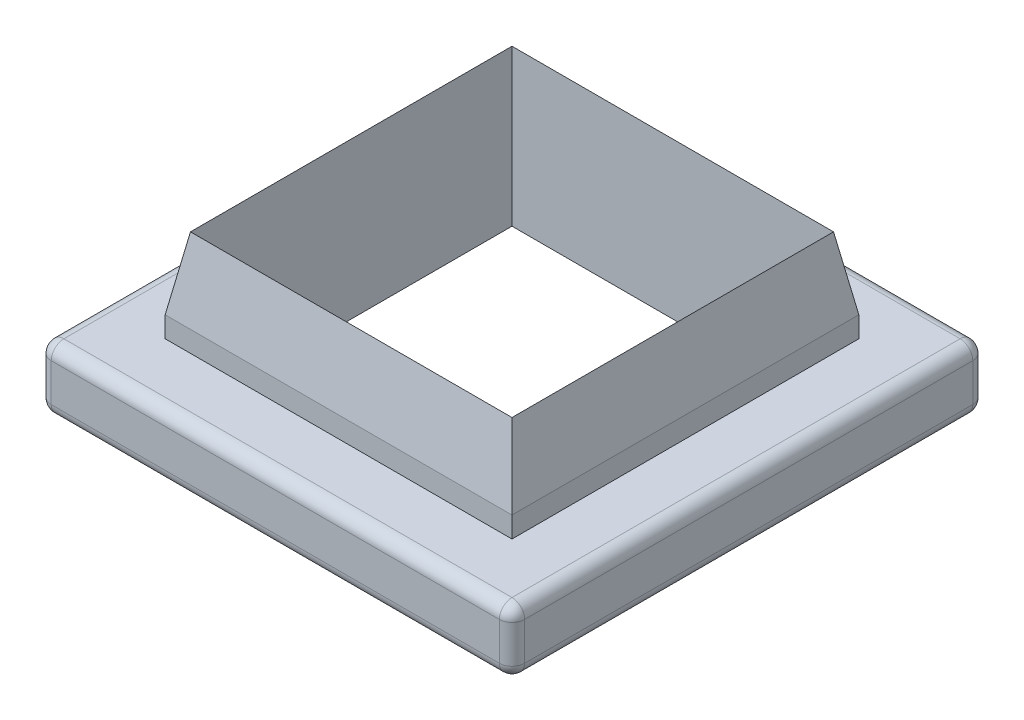
ISO-10303-21;
HEADER;
FILE_DESCRIPTION(('STEP AP214'),'2;1');
FILE_NAME('part.step','',(''),(''),'','','');
FILE_SCHEMA(('AUTOMOTIVE_DESIGN { 1 0 10303 214 1 1 1 1 }'));
ENDSEC;
DATA;
#1=APPLICATION_CONTEXT('core data for automotive mechanical design processes');
#2=APPLICATION_PROTOCOL_DEFINITION('international standard','automotive_design',2000,#1);
#3=PRODUCT_CONTEXT('',#1,'mechanical');
#4=PRODUCT('Part','Part','',(#3));
#5=PRODUCT_RELATED_PRODUCT_CATEGORY('part','',(#4));
#6=PRODUCT_DEFINITION_FORMATION('','',#4);
#7=PRODUCT_DEFINITION_CONTEXT('part definition',#1,'design');
#8=PRODUCT_DEFINITION('design','',#6,#7);
#9=PRODUCT_DEFINITION_SHAPE('','',#8);
#10=(LENGTH_UNIT() NAMED_UNIT(*) SI_UNIT(.MILLI.,.METRE.));
#11=(NAMED_UNIT(*) PLANE_ANGLE_UNIT() SI_UNIT($,.RADIAN.));
#12=(NAMED_UNIT(*) SI_UNIT($,.STERADIAN.) SOLID_ANGLE_UNIT());
#13=UNCERTAINTY_MEASURE_WITH_UNIT(LENGTH_MEASURE(1.E-05),#10,'distance_accuracy_value','');
#14=(GEOMETRIC_REPRESENTATION_CONTEXT(3) GLOBAL_UNCERTAINTY_ASSIGNED_CONTEXT((#13)) GLOBAL_UNIT_ASSIGNED_CONTEXT((#10,
#11,#12)) REPRESENTATION_CONTEXT('',''));
#15=CARTESIAN_POINT('',(0.,0.,0.));
#16=DIRECTION('',(0.,0.,1.));
#17=DIRECTION('',(1.,0.,0.));
#18=AXIS2_PLACEMENT_3D('',#15,#16,#17);
#19=CARTESIAN_POINT('',(0.,35.,0.));
#20=DIRECTION('',(0.,0.,-1.));
#21=DIRECTION('',(-1.,0.,0.));
#22=AXIS2_PLACEMENT_3D('',#19,#20,#21);
#23=PLANE('',#22);
#24=DIRECTION('',(0.,-1.,0.));
#25=VECTOR('',#24,1.);
#26=CARTESIAN_POINT('',(27.4,35.,0.));
#27=LINE('',#26,#25);
#28=CARTESIAN_POINT('',(27.4,6.64359090190982,0.));
#29=VERTEX_POINT('',#28);
#30=CARTESIAN_POINT('',(27.4,5.,0.));
#31=VERTEX_POINT('',#30);
#32=EDGE_CURVE('E237',#29,#31,#27,.T.);
#33=ORIENTED_EDGE('',*,*,#32,.F.);
#34=DIRECTION('',(-1.,0.,0.));
#35=VECTOR('',#34,1.);
#36=CARTESIAN_POINT('',(0.,6.64359090190982,0.));
#37=LINE('',#36,#35);
#38=CARTESIAN_POINT('',(0.,6.64359090190982,0.));
#39=VERTEX_POINT('',#38);
#40=EDGE_CURVE('E266',#29,#39,#37,.T.);
#41=ORIENTED_EDGE('',*,*,#40,.T.);
#42=DIRECTION('',(0.,-1.,0.));
#43=VECTOR('',#42,1.);
#44=CARTESIAN_POINT('',(0.,35.,0.));
#45=LINE('',#44,#43);
#46=CARTESIAN_POINT('',(0.,5.,0.));
#47=VERTEX_POINT('',#46);
#48=EDGE_CURVE('E194',#39,#47,#45,.T.);
#49=ORIENTED_EDGE('',*,*,#48,.T.);
#50=DIRECTION('',(1.,0.,0.));
#51=VECTOR('',#50,1.);
#52=CARTESIAN_POINT('',(0.,5.,0.));
#53=LINE('',#52,#51);
#54=EDGE_CURVE('E208',#47,#31,#53,.T.);
#55=ORIENTED_EDGE('',*,*,#54,.T.);
#56=EDGE_LOOP('',(#33,#41,#49,#55));
#57=FACE_BOUND('',#56,.T.);
#58=ADVANCED_FACE('F43',(#57),#23,.F.);
#59=CARTESIAN_POINT('',(27.4,35.,0.));
#60=DIRECTION('',(-1.,0.,0.));
#61=DIRECTION('',(0.,0.,1.));
#62=AXIS2_PLACEMENT_3D('',#59,#60,#61);
#63=PLANE('',#62);
#64=DIRECTION('',(0.,-1.,0.));
#65=VECTOR('',#64,1.);
#66=CARTESIAN_POINT('',(27.4,35.,-27.4));
#67=LINE('',#66,#65);
#68=CARTESIAN_POINT('',(27.4,6.64359090190982,-27.4));
#69=VERTEX_POINT('',#68);
#70=CARTESIAN_POINT('',(27.4,5.,-27.4));
#71=VERTEX_POINT('',#70);
#72=EDGE_CURVE('E193',#69,#71,#67,.T.);
#73=ORIENTED_EDGE('',*,*,#72,.F.);
#74=DIRECTION('',(0.,0.,1.));
#75=VECTOR('',#74,1.);
#76=CARTESIAN_POINT('',(27.4,6.64359090190982,0.));
#77=LINE('',#76,#75);
#78=EDGE_CURVE('E260',#69,#29,#77,.T.);
#79=ORIENTED_EDGE('',*,*,#78,.T.);
#80=ORIENTED_EDGE('',*,*,#32,.T.);
#81=DIRECTION('',(0.,0.,-1.));
#82=VECTOR('',#81,1.);
#83=CARTESIAN_POINT('',(27.4,5.,0.));
#84=LINE('',#83,#82);
#85=EDGE_CURVE('E212',#31,#71,#84,.T.);
#86=ORIENTED_EDGE('',*,*,#85,.T.);
#87=EDGE_LOOP('',(#73,#79,#80,#86));
#88=FACE_BOUND('',#87,.T.);
#89=ADVANCED_FACE('F526',(#88),#63,.F.);
#90=CARTESIAN_POINT('',(0.,35.,-27.4));
#91=DIRECTION('',(0.,0.,-1.));
#92=DIRECTION('',(-1.,0.,0.));
#93=AXIS2_PLACEMENT_3D('',#90,#91,#92);
#94=PLANE('',#93);
#95=DIRECTION('',(0.,-1.,0.));
#96=VECTOR('',#95,1.);
#97=CARTESIAN_POINT('',(0.,35.,-27.4));
#98=LINE('',#97,#96);
#99=CARTESIAN_POINT('',(0.,6.64359090190982,-27.4));
#100=VERTEX_POINT('',#99);
#101=CARTESIAN_POINT('',(0.,5.,-27.4));
#102=VERTEX_POINT('',#101);
#103=EDGE_CURVE('E180',#100,#102,#98,.T.);
#104=ORIENTED_EDGE('',*,*,#103,.F.);
#105=DIRECTION('',(1.,0.,0.));
#106=VECTOR('',#105,1.);
#107=CARTESIAN_POINT('',(0.,6.64359090190982,-27.4));
#108=LINE('',#107,#106);
#109=EDGE_CURVE('E240',#100,#69,#108,.T.);
#110=ORIENTED_EDGE('',*,*,#109,.T.);
#111=ORIENTED_EDGE('',*,*,#72,.T.);
#112=DIRECTION('',(1.,0.,0.));
#113=VECTOR('',#112,1.);
#114=CARTESIAN_POINT('',(0.,5.,-27.4));
#115=LINE('',#114,#113);
#116=EDGE_CURVE('E197',#102,#71,#115,.T.);
#117=ORIENTED_EDGE('',*,*,#116,.F.);
#118=EDGE_LOOP('',(#104,#110,#111,#117));
#119=FACE_BOUND('',#118,.T.);
#120=ADVANCED_FACE('F198',(#119),#94,.T.);
#121=CARTESIAN_POINT('',(0.,35.,-1.));
#122=DIRECTION('',(0.,0.,-1.));
#123=DIRECTION('',(-1.,0.,0.));
#124=AXIS2_PLACEMENT_3D('',#121,#122,#123);
#125=PLANE('',#124);
#126=DIRECTION('',(0.,-1.,0.));
#127=VECTOR('',#126,1.);
#128=CARTESIAN_POINT('',(1.,35.,-1.));
#129=LINE('',#128,#127);
#130=CARTESIAN_POINT('',(1.,12.3148727215276,-1.));
#131=VERTEX_POINT('',#130);
#132=CARTESIAN_POINT('',(1.,0.,-1.));
#133=VERTEX_POINT('',#132);
#134=EDGE_CURVE('E233',#131,#133,#129,.T.);
#135=ORIENTED_EDGE('',*,*,#134,.F.);
#136=DIRECTION('',(1.,0.,0.));
#137=VECTOR('',#136,1.);
#138=CARTESIAN_POINT('',(0.,12.3148727215276,-1.));
#139=LINE('',#138,#137);
#140=CARTESIAN_POINT('',(26.4,12.3148727215276,-1.));
#141=VERTEX_POINT('',#140);
#142=EDGE_CURVE('E263',#131,#141,#139,.T.);
#143=ORIENTED_EDGE('',*,*,#142,.T.);
#144=DIRECTION('',(0.,-1.,0.));
#145=VECTOR('',#144,1.);
#146=CARTESIAN_POINT('',(26.4,35.,-1.));
#147=LINE('',#146,#145);
#148=CARTESIAN_POINT('',(26.4,0.,-1.));
#149=VERTEX_POINT('',#148);
#150=EDGE_CURVE('E231',#141,#149,#147,.T.);
#151=ORIENTED_EDGE('',*,*,#150,.T.);
#152=DIRECTION('',(1.,0.,0.));
#153=VECTOR('',#152,1.);
#154=CARTESIAN_POINT('',(0.,0.,-1.));
#155=LINE('',#154,#153);
#156=EDGE_CURVE('E204',#133,#149,#155,.T.);
#157=ORIENTED_EDGE('',*,*,#156,.F.);
#158=EDGE_LOOP('',(#135,#143,#151,#157));
#159=FACE_BOUND('',#158,.T.);
#160=ADVANCED_FACE('F548',(#159),#125,.T.);
#161=CARTESIAN_POINT('',(1.,35.,0.));
#162=DIRECTION('',(-1.,0.,0.));
#163=DIRECTION('',(0.,0.,1.));
#164=AXIS2_PLACEMENT_3D('',#161,#162,#163);
#165=PLANE('',#164);
#166=DIRECTION('',(0.,-1.,0.));
#167=VECTOR('',#166,1.);
#168=CARTESIAN_POINT('',(1.,35.,-26.4));
#169=LINE('',#168,#167);
#170=CARTESIAN_POINT('',(1.,12.3148727215276,-26.4));
#171=VERTEX_POINT('',#170);
#172=CARTESIAN_POINT('',(1.,0.,-26.4));
#173=VERTEX_POINT('',#172);
#174=EDGE_CURVE('E246',#171,#173,#169,.T.);
#175=ORIENTED_EDGE('',*,*,#174,.F.);
#176=DIRECTION('',(0.,0.,-1.));
#177=VECTOR('',#176,1.);
#178=CARTESIAN_POINT('',(1.,12.3148727215276,0.));
#179=LINE('',#178,#177);
#180=EDGE_CURVE('E271',#171,#131,#179,.F.);
#181=ORIENTED_EDGE('',*,*,#180,.T.);
#182=ORIENTED_EDGE('',*,*,#134,.T.);
#183=DIRECTION('',(0.,0.,-1.));
#184=VECTOR('',#183,1.);
#185=CARTESIAN_POINT('',(1.,0.,0.));
#186=LINE('',#185,#184);
#187=EDGE_CURVE('E219',#133,#173,#186,.T.);
#188=ORIENTED_EDGE('',*,*,#187,.T.);
#189=EDGE_LOOP('',(#175,#181,#182,#188));
#190=FACE_BOUND('',#189,.T.);
#191=ADVANCED_FACE('F544',(#190),#165,.F.);
#192=CARTESIAN_POINT('',(0.,35.,-26.4));
#193=DIRECTION('',(0.,0.,-1.));
#194=DIRECTION('',(-1.,0.,0.));
#195=AXIS2_PLACEMENT_3D('',#192,#193,#194);
#196=PLANE('',#195);
#197=DIRECTION('',(0.,-1.,0.));
#198=VECTOR('',#197,1.);
#199=CARTESIAN_POINT('',(26.4,35.,-26.4));
#200=LINE('',#199,#198);
#201=CARTESIAN_POINT('',(26.4,12.3148727215276,-26.4));
#202=VERTEX_POINT('',#201);
#203=CARTESIAN_POINT('',(26.4,0.,-26.4));
#204=VERTEX_POINT('',#203);
#205=EDGE_CURVE('E243',#202,#204,#200,.T.);
#206=ORIENTED_EDGE('',*,*,#205,.F.);
#207=DIRECTION('',(1.,0.,0.));
#208=VECTOR('',#207,1.);
#209=CARTESIAN_POINT('',(0.,12.3148727215276,-26.4));
#210=LINE('',#209,#208);
#211=EDGE_CURVE('E253',#202,#171,#210,.F.);
#212=ORIENTED_EDGE('',*,*,#211,.T.);
#213=ORIENTED_EDGE('',*,*,#174,.T.);
#214=DIRECTION('',(1.,0.,0.));
#215=VECTOR('',#214,1.);
#216=CARTESIAN_POINT('',(0.,0.,-26.4));
#217=LINE('',#216,#215);
#218=EDGE_CURVE('E223',#173,#204,#217,.T.);
#219=ORIENTED_EDGE('',*,*,#218,.T.);
#220=EDGE_LOOP('',(#206,#212,#213,#219));
#221=FACE_BOUND('',#220,.T.);
#222=ADVANCED_FACE('F540',(#221),#196,.F.);
#223=CARTESIAN_POINT('',(26.4,35.,0.));
#224=DIRECTION('',(-1.,0.,0.));
#225=DIRECTION('',(0.,0.,1.));
#226=AXIS2_PLACEMENT_3D('',#223,#224,#225);
#227=PLANE('',#226);
#228=ORIENTED_EDGE('',*,*,#150,.F.);
#229=DIRECTION('',(0.,0.,-1.));
#230=VECTOR('',#229,1.);
#231=CARTESIAN_POINT('',(26.4,12.3148727215276,0.));
#232=LINE('',#231,#230);
#233=EDGE_CURVE('E257',#141,#202,#232,.T.);
#234=ORIENTED_EDGE('',*,*,#233,.T.);
#235=ORIENTED_EDGE('',*,*,#205,.T.);
#236=DIRECTION('',(0.,0.,-1.));
#237=VECTOR('',#236,1.);
#238=CARTESIAN_POINT('',(26.4,0.,0.));
#239=LINE('',#238,#237);
#240=EDGE_CURVE('E227',#149,#204,#239,.T.);
#241=ORIENTED_EDGE('',*,*,#240,.F.);
#242=EDGE_LOOP('',(#228,#234,#235,#241));
#243=FACE_BOUND('',#242,.T.);
#244=ADVANCED_FACE('F537',(#243),#227,.T.);
#245=CARTESIAN_POINT('',(0.,35.,0.));
#246=DIRECTION('',(-1.,0.,0.));
#247=DIRECTION('',(0.,0.,1.));
#248=AXIS2_PLACEMENT_3D('',#245,#246,#247);
#249=PLANE('',#248);
#250=ORIENTED_EDGE('',*,*,#48,.F.);
#251=DIRECTION('',(0.,0.,-1.));
#252=VECTOR('',#251,1.);
#253=CARTESIAN_POINT('',(0.,6.64359090190982,0.));
#254=LINE('',#253,#252);
#255=EDGE_CURVE('E188',#39,#100,#254,.T.);
#256=ORIENTED_EDGE('',*,*,#255,.T.);
#257=ORIENTED_EDGE('',*,*,#103,.T.);
#258=DIRECTION('',(0.,0.,-1.));
#259=VECTOR('',#258,1.);
#260=CARTESIAN_POINT('',(0.,5.,0.));
#261=LINE('',#260,#259);
#262=EDGE_CURVE('E185',#47,#102,#261,.T.);
#263=ORIENTED_EDGE('',*,*,#262,.F.);
#264=EDGE_LOOP('',(#250,#256,#257,#263));
#265=FACE_BOUND('',#264,.T.);
#266=ADVANCED_FACE('F183',(#265),#249,.T.);
#267=CARTESIAN_POINT('',(0.,0.,0.));
#268=DIRECTION('',(0.,1.,0.));
#269=DIRECTION('',(0.,0.,1.));
#270=AXIS2_PLACEMENT_3D('',#267,#268,#269);
#271=PLANE('',#270);
#272=DIRECTION('',(1.,0.,0.));
#273=VECTOR('',#272,1.);
#274=CARTESIAN_POINT('',(32.4,0.,-31.4));
#275=LINE('',#274,#273);
#276=CARTESIAN_POINT('',(-4.,0.,-31.4));
#277=VERTEX_POINT('',#276);
#278=CARTESIAN_POINT('',(31.4,0.,-31.4));
#279=VERTEX_POINT('',#278);
#280=EDGE_CURVE('E343',#277,#279,#275,.T.);
#281=ORIENTED_EDGE('',*,*,#280,.T.);
#282=DIRECTION('',(0.,0.,-1.));
#283=VECTOR('',#282,1.);
#284=CARTESIAN_POINT('',(31.4,0.,0.));
#285=LINE('',#284,#283);
#286=CARTESIAN_POINT('',(31.4,0.,4.));
#287=VERTEX_POINT('',#286);
#288=EDGE_CURVE('E350',#279,#287,#285,.F.);
#289=ORIENTED_EDGE('',*,*,#288,.T.);
#290=DIRECTION('',(1.,0.,0.));
#291=VECTOR('',#290,1.);
#292=CARTESIAN_POINT('',(0.,0.,4.));
#293=LINE('',#292,#291);
#294=CARTESIAN_POINT('',(-4.,0.,4.));
#295=VERTEX_POINT('',#294);
#296=EDGE_CURVE('E346',#287,#295,#293,.F.);
#297=ORIENTED_EDGE('',*,*,#296,.T.);
#298=DIRECTION('',(0.,0.,-1.));
#299=VECTOR('',#298,1.);
#300=CARTESIAN_POINT('',(-4.,0.,-32.4));
#301=LINE('',#300,#299);
#302=EDGE_CURVE('E340',#295,#277,#301,.T.);
#303=ORIENTED_EDGE('',*,*,#302,.T.);
#304=EDGE_LOOP('',(#281,#289,#297,#303));
#305=FACE_BOUND('',#304,.T.);
#306=ORIENTED_EDGE('',*,*,#156,.T.);
#307=ORIENTED_EDGE('',*,*,#240,.T.);
#308=ORIENTED_EDGE('',*,*,#218,.F.);
#309=ORIENTED_EDGE('',*,*,#187,.F.);
#310=EDGE_LOOP('',(#306,#307,#308,#309));
#311=FACE_BOUND('',#310,.T.);
#312=ADVANCED_FACE('F626',(#305,#311),#271,.F.);
#313=CARTESIAN_POINT('',(-5.,5.,0.));
#314=DIRECTION('',(-1.,0.,0.));
#315=DIRECTION('',(0.,0.,1.));
#316=AXIS2_PLACEMENT_3D('',#313,#314,#315);
#317=PLANE('',#316);
#318=DIRECTION('',(0.,-1.,0.));
#319=VECTOR('',#318,1.);
#320=CARTESIAN_POINT('',(-5.,5.,4.));
#321=LINE('',#320,#319);
#322=CARTESIAN_POINT('',(-5.,1.,4.));
#323=VERTEX_POINT('',#322);
#324=CARTESIAN_POINT('',(-5.,4.,4.));
#325=VERTEX_POINT('',#324);
#326=EDGE_CURVE('E307',#323,#325,#321,.F.);
#327=ORIENTED_EDGE('',*,*,#326,.T.);
#328=DIRECTION('',(0.,0.,-1.));
#329=VECTOR('',#328,1.);
#330=CARTESIAN_POINT('',(-5.,4.,0.));
#331=LINE('',#330,#329);
#332=CARTESIAN_POINT('',(-5.,4.,-31.4));
#333=VERTEX_POINT('',#332);
#334=EDGE_CURVE('E311',#325,#333,#331,.T.);
#335=ORIENTED_EDGE('',*,*,#334,.T.);
#336=DIRECTION('',(0.,-1.,0.));
#337=VECTOR('',#336,1.);
#338=CARTESIAN_POINT('',(-5.,5.,-31.4));
#339=LINE('',#338,#337);
#340=CARTESIAN_POINT('',(-5.,1.,-31.4));
#341=VERTEX_POINT('',#340);
#342=EDGE_CURVE('E304',#333,#341,#339,.T.);
#343=ORIENTED_EDGE('',*,*,#342,.T.);
#344=DIRECTION('',(0.,0.,-1.));
#345=VECTOR('',#344,1.);
#346=CARTESIAN_POINT('',(-5.,1.,5.));
#347=LINE('',#346,#345);
#348=EDGE_CURVE('E301',#341,#323,#347,.F.);
#349=ORIENTED_EDGE('',*,*,#348,.T.);
#350=EDGE_LOOP('',(#327,#335,#343,#349));
#351=FACE_BOUND('',#350,.T.);
#352=ADVANCED_FACE('F612',(#351),#317,.T.);
#353=CARTESIAN_POINT('',(0.,5.,5.));
#354=DIRECTION('',(0.,0.,-1.));
#355=DIRECTION('',(-1.,0.,0.));
#356=AXIS2_PLACEMENT_3D('',#353,#354,#355);
#357=PLANE('',#356);
#358=DIRECTION('',(1.,0.,0.));
#359=VECTOR('',#358,1.);
#360=CARTESIAN_POINT('',(-5.,4.,5.));
#361=LINE('',#360,#359);
#362=CARTESIAN_POINT('',(31.4,4.,5.));
#363=VERTEX_POINT('',#362);
#364=CARTESIAN_POINT('',(-4.,4.,5.));
#365=VERTEX_POINT('',#364);
#366=EDGE_CURVE('E294',#363,#365,#361,.F.);
#367=ORIENTED_EDGE('',*,*,#366,.T.);
#368=DIRECTION('',(0.,-1.,0.));
#369=VECTOR('',#368,1.);
#370=CARTESIAN_POINT('',(-4.,0.,5.));
#371=LINE('',#370,#369);
#372=CARTESIAN_POINT('',(-4.,1.,5.));
#373=VERTEX_POINT('',#372);
#374=EDGE_CURVE('E297',#365,#373,#371,.T.);
#375=ORIENTED_EDGE('',*,*,#374,.T.);
#376=DIRECTION('',(1.,0.,0.));
#377=VECTOR('',#376,1.);
#378=CARTESIAN_POINT('',(0.,1.,5.));
#379=LINE('',#378,#377);
#380=CARTESIAN_POINT('',(31.4,1.,5.));
#381=VERTEX_POINT('',#380);
#382=EDGE_CURVE('E274',#373,#381,#379,.T.);
#383=ORIENTED_EDGE('',*,*,#382,.T.);
#384=DIRECTION('',(0.,-1.,0.));
#385=VECTOR('',#384,1.);
#386=CARTESIAN_POINT('',(31.4,5.,5.));
#387=LINE('',#386,#385);
#388=EDGE_CURVE('E291',#381,#363,#387,.F.);
#389=ORIENTED_EDGE('',*,*,#388,.T.);
#390=EDGE_LOOP('',(#367,#375,#383,#389));
#391=FACE_BOUND('',#390,.T.);
#392=ADVANCED_FACE('F618',(#391),#357,.F.);
#393=CARTESIAN_POINT('',(32.4,5.,0.));
#394=DIRECTION('',(-1.,0.,0.));
#395=DIRECTION('',(0.,0.,1.));
#396=AXIS2_PLACEMENT_3D('',#393,#394,#395);
#397=PLANE('',#396);
#398=DIRECTION('',(0.,-1.,0.));
#399=VECTOR('',#398,1.);
#400=CARTESIAN_POINT('',(32.4,5.,4.));
#401=LINE('',#400,#399);
#402=CARTESIAN_POINT('',(32.4,4.,4.));
#403=VERTEX_POINT('',#402);
#404=CARTESIAN_POINT('',(32.4,1.,4.));
#405=VERTEX_POINT('',#404);
#406=EDGE_CURVE('E333',#403,#405,#401,.T.);
#407=ORIENTED_EDGE('',*,*,#406,.T.);
#408=DIRECTION('',(0.,0.,-1.));
#409=VECTOR('',#408,1.);
#410=CARTESIAN_POINT('',(32.4,1.,0.));
#411=LINE('',#410,#409);
#412=CARTESIAN_POINT('',(32.4,1.,-31.4));
#413=VERTEX_POINT('',#412);
#414=EDGE_CURVE('E337',#405,#413,#411,.T.);
#415=ORIENTED_EDGE('',*,*,#414,.T.);
#416=DIRECTION('',(0.,-1.,0.));
#417=VECTOR('',#416,1.);
#418=CARTESIAN_POINT('',(32.4,5.,-31.4));
#419=LINE('',#418,#417);
#420=CARTESIAN_POINT('',(32.4,4.,-31.4));
#421=VERTEX_POINT('',#420);
#422=EDGE_CURVE('E330',#413,#421,#419,.F.);
#423=ORIENTED_EDGE('',*,*,#422,.T.);
#424=DIRECTION('',(0.,0.,-1.));
#425=VECTOR('',#424,1.);
#426=CARTESIAN_POINT('',(32.4,4.,5.));
#427=LINE('',#426,#425);
#428=EDGE_CURVE('E327',#421,#403,#427,.F.);
#429=ORIENTED_EDGE('',*,*,#428,.T.);
#430=EDGE_LOOP('',(#407,#415,#423,#429));
#431=FACE_BOUND('',#430,.T.);
#432=ADVANCED_FACE('F472',(#431),#397,.F.);
#433=CARTESIAN_POINT('',(0.,5.,-32.4));
#434=DIRECTION('',(0.,0.,-1.));
#435=DIRECTION('',(-1.,0.,0.));
#436=AXIS2_PLACEMENT_3D('',#433,#434,#435);
#437=PLANE('',#436);
#438=DIRECTION('',(1.,0.,0.));
#439=VECTOR('',#438,1.);
#440=CARTESIAN_POINT('',(0.,4.,-32.4));
#441=LINE('',#440,#439);
#442=CARTESIAN_POINT('',(-4.,4.,-32.4));
#443=VERTEX_POINT('',#442);
#444=CARTESIAN_POINT('',(31.4,4.,-32.4));
#445=VERTEX_POINT('',#444);
#446=EDGE_CURVE('E64',#443,#445,#441,.T.);
#447=ORIENTED_EDGE('',*,*,#446,.T.);
#448=DIRECTION('',(0.,-1.,0.));
#449=VECTOR('',#448,1.);
#450=CARTESIAN_POINT('',(31.4,0.,-32.4));
#451=LINE('',#450,#449);
#452=CARTESIAN_POINT('',(31.4,1.,-32.4));
#453=VERTEX_POINT('',#452);
#454=EDGE_CURVE('E11',#445,#453,#451,.T.);
#455=ORIENTED_EDGE('',*,*,#454,.T.);
#456=DIRECTION('',(1.,0.,0.));
#457=VECTOR('',#456,1.);
#458=CARTESIAN_POINT('',(-5.,1.,-32.4));
#459=LINE('',#458,#457);
#460=CARTESIAN_POINT('',(-4.,1.,-32.4));
#461=VERTEX_POINT('',#460);
#462=EDGE_CURVE('E53',#453,#461,#459,.F.);
#463=ORIENTED_EDGE('',*,*,#462,.T.);
#464=DIRECTION('',(0.,-1.,0.));
#465=VECTOR('',#464,1.);
#466=CARTESIAN_POINT('',(-4.,5.,-32.4));
#467=LINE('',#466,#465);
#468=EDGE_CURVE('E353',#461,#443,#467,.F.);
#469=ORIENTED_EDGE('',*,*,#468,.T.);
#470=EDGE_LOOP('',(#447,#455,#463,#469));
#471=FACE_BOUND('',#470,.T.);
#472=ADVANCED_FACE('F493',(#471),#437,.T.);
#473=CARTESIAN_POINT('',(0.,5.,0.));
#474=DIRECTION('',(0.,1.,0.));
#475=DIRECTION('',(0.,0.,1.));
#476=AXIS2_PLACEMENT_3D('',#473,#474,#475);
#477=PLANE('',#476);
#478=DIRECTION('',(1.,0.,0.));
#479=VECTOR('',#478,1.);
#480=CARTESIAN_POINT('',(32.4,5.,4.));
#481=LINE('',#480,#479);
#482=CARTESIAN_POINT('',(-4.,5.,4.));
#483=VERTEX_POINT('',#482);
#484=CARTESIAN_POINT('',(31.4,5.,4.));
#485=VERTEX_POINT('',#484);
#486=EDGE_CURVE('E320',#483,#485,#481,.T.);
#487=ORIENTED_EDGE('',*,*,#486,.T.);
#488=DIRECTION('',(0.,0.,-1.));
#489=VECTOR('',#488,1.);
#490=CARTESIAN_POINT('',(31.4,5.,-32.4));
#491=LINE('',#490,#489);
#492=CARTESIAN_POINT('',(31.4,5.,-31.4));
#493=VERTEX_POINT('',#492);
#494=EDGE_CURVE('E324',#485,#493,#491,.T.);
#495=ORIENTED_EDGE('',*,*,#494,.T.);
#496=DIRECTION('',(1.,0.,0.));
#497=VECTOR('',#496,1.);
#498=CARTESIAN_POINT('',(0.,5.,-31.4));
#499=LINE('',#498,#497);
#500=CARTESIAN_POINT('',(-4.,5.,-31.4));
#501=VERTEX_POINT('',#500);
#502=EDGE_CURVE('E317',#493,#501,#499,.F.);
#503=ORIENTED_EDGE('',*,*,#502,.T.);
#504=DIRECTION('',(0.,0.,-1.));
#505=VECTOR('',#504,1.);
#506=CARTESIAN_POINT('',(-4.,5.,0.));
#507=LINE('',#506,#505);
#508=EDGE_CURVE('E314',#501,#483,#507,.F.);
#509=ORIENTED_EDGE('',*,*,#508,.T.);
#510=EDGE_LOOP('',(#487,#495,#503,#509));
#511=FACE_BOUND('',#510,.T.);
#512=ORIENTED_EDGE('',*,*,#85,.F.);
#513=ORIENTED_EDGE('',*,*,#54,.F.);
#514=ORIENTED_EDGE('',*,*,#262,.T.);
#515=ORIENTED_EDGE('',*,*,#116,.T.);
#516=EDGE_LOOP('',(#512,#513,#514,#515));
#517=FACE_BOUND('',#516,.T.);
#518=ADVANCED_FACE('F206',(#511,#517),#477,.T.);
#519=CARTESIAN_POINT('',(0.,35.,-5.0000000000002));
#520=DIRECTION('',(0.,0.173648177666927,0.984807753012209));
#521=DIRECTION('',(-1.,0.,0.));
#522=AXIS2_PLACEMENT_3D('',#519,#520,#521);
#523=PLANE('',#522);
#524=DIRECTION('',(-0.171087869746033,0.970287525247815,-0.171087869746033));
#525=VECTOR('',#524,1.);
#526=CARTESIAN_POINT('',(21.7443282744969,38.7184991364819,-5.65567172550307));
#527=LINE('',#526,#525);
#528=EDGE_CURVE('E281',#141,#29,#527,.F.);
#529=ORIENTED_EDGE('',*,*,#528,.F.);
#530=ORIENTED_EDGE('',*,*,#142,.F.);
#531=DIRECTION('',(-0.171087869746033,-0.970287525247815,0.171087869746033));
#532=VECTOR('',#531,1.);
#533=CARTESIAN_POINT('',(0.,6.64359090190982,0.));
#534=LINE('',#533,#532);
#535=EDGE_CURVE('E285',#39,#131,#534,.F.);
#536=ORIENTED_EDGE('',*,*,#535,.F.);
#537=ORIENTED_EDGE('',*,*,#40,.F.);
#538=EDGE_LOOP('',(#529,#530,#536,#537));
#539=FACE_BOUND('',#538,.T.);
#540=ADVANCED_FACE('F574',(#539),#523,.T.);
#541=CARTESIAN_POINT('',(0.,6.64359090190982,0.));
#542=DIRECTION('',(0.984807753012209,-0.173648177666927,0.));
#543=DIRECTION('',(0.,0.,-1.));
#544=AXIS2_PLACEMENT_3D('',#541,#542,#543);
#545=PLANE('',#544);
#546=ORIENTED_EDGE('',*,*,#535,.T.);
#547=ORIENTED_EDGE('',*,*,#180,.F.);
#548=DIRECTION('',(-0.171087869746033,-0.970287525247815,-0.171087869746033));
#549=VECTOR('',#548,1.);
#550=CARTESIAN_POINT('',(0.802027021374051,11.1921121670707,-26.5979729786259));
#551=LINE('',#550,#549);
#552=EDGE_CURVE('E278',#100,#171,#551,.F.);
#553=ORIENTED_EDGE('',*,*,#552,.F.);
#554=ORIENTED_EDGE('',*,*,#255,.F.);
#555=EDGE_LOOP('',(#546,#547,#553,#554));
#556=FACE_BOUND('',#555,.T.);
#557=ADVANCED_FACE('F567',(#556),#545,.F.);
#558=CARTESIAN_POINT('',(22.3999999999998,35.,0.));
#559=DIRECTION('',(0.984807753012209,0.173648177666927,0.));
#560=DIRECTION('',(0.,0.,1.));
#561=AXIS2_PLACEMENT_3D('',#558,#559,#560);
#562=PLANE('',#561);
#563=ORIENTED_EDGE('',*,*,#528,.T.);
#564=ORIENTED_EDGE('',*,*,#78,.F.);
#565=DIRECTION('',(0.171087869746033,-0.970287525247815,-0.171087869746033));
#566=VECTOR('',#565,1.);
#567=CARTESIAN_POINT('',(21.7443282744969,38.7184991364819,-21.7443282744969));
#568=LINE('',#567,#566);
#569=EDGE_CURVE('E275',#202,#69,#568,.T.);
#570=ORIENTED_EDGE('',*,*,#569,.F.);
#571=ORIENTED_EDGE('',*,*,#233,.F.);
#572=EDGE_LOOP('',(#563,#564,#570,#571));
#573=FACE_BOUND('',#572,.T.);
#574=ADVANCED_FACE('F560',(#573),#562,.T.);
#575=CARTESIAN_POINT('',(0.,6.64359090190982,-27.4));
#576=DIRECTION('',(0.,-0.173648177666927,0.984807753012209));
#577=DIRECTION('',(1.,0.,0.));
#578=AXIS2_PLACEMENT_3D('',#575,#576,#577);
#579=PLANE('',#578);
#580=ORIENTED_EDGE('',*,*,#552,.T.);
#581=ORIENTED_EDGE('',*,*,#211,.F.);
#582=ORIENTED_EDGE('',*,*,#569,.T.);
#583=ORIENTED_EDGE('',*,*,#109,.F.);
#584=EDGE_LOOP('',(#580,#581,#582,#583));
#585=FACE_BOUND('',#584,.T.);
#586=ADVANCED_FACE('F554',(#585),#579,.F.);
#587=CARTESIAN_POINT('',(31.4,5.,-31.4));
#588=DIRECTION('',(0.,1.,0.));
#589=DIRECTION('',(0.,0.,1.));
#590=AXIS2_PLACEMENT_3D('',#587,#588,#589);
#591=CYLINDRICAL_SURFACE('',#590,1.);
#592=CARTESIAN_POINT('',(31.4,4.,-31.4));
#593=DIRECTION('',(0.,1.,0.));
#594=DIRECTION('',(0.,0.,1.));
#595=AXIS2_PLACEMENT_3D('',#592,#593,#594);
#596=CIRCLE('',#595,1.);
#597=EDGE_CURVE('E47',#421,#445,#596,.T.);
#598=ORIENTED_EDGE('',*,*,#597,.F.);
#599=ORIENTED_EDGE('',*,*,#422,.F.);
#600=CARTESIAN_POINT('',(31.4,1.,-31.4));
#601=DIRECTION('',(0.,-1.,0.));
#602=DIRECTION('',(0.,0.,-1.));
#603=AXIS2_PLACEMENT_3D('',#600,#601,#602);
#604=CIRCLE('',#603,1.);
#605=EDGE_CURVE('E441',#453,#413,#604,.T.);
#606=ORIENTED_EDGE('',*,*,#605,.F.);
#607=ORIENTED_EDGE('',*,*,#454,.F.);
#608=EDGE_LOOP('',(#598,#599,#606,#607));
#609=FACE_BOUND('',#608,.T.);
#610=ADVANCED_FACE('F45',(#609),#591,.T.);
#611=CARTESIAN_POINT('',(31.4,4.,-31.4));
#612=DIRECTION('',(0.,0.,-1.));
#613=DIRECTION('',(-1.,0.,0.));
#614=AXIS2_PLACEMENT_3D('',#611,#612,#613);
#615=SPHERICAL_SURFACE('',#614,1.);
#616=CARTESIAN_POINT('',(31.4,4.,-31.4));
#617=DIRECTION('',(0.,0.,-1.));
#618=DIRECTION('',(-1.,0.,0.));
#619=AXIS2_PLACEMENT_3D('',#616,#617,#618);
#620=CIRCLE('',#619,1.);
#621=EDGE_CURVE('E434',#421,#493,#620,.F.);
#622=ORIENTED_EDGE('',*,*,#621,.F.);
#623=ORIENTED_EDGE('',*,*,#597,.T.);
#624=CARTESIAN_POINT('',(31.4,4.,-31.4));
#625=DIRECTION('',(1.,0.,0.));
#626=DIRECTION('',(0.,0.,-1.));
#627=AXIS2_PLACEMENT_3D('',#624,#625,#626);
#628=CIRCLE('',#627,1.);
#629=EDGE_CURVE('E438',#493,#445,#628,.F.);
#630=ORIENTED_EDGE('',*,*,#629,.F.);
#631=EDGE_LOOP('',(#622,#623,#630));
#632=FACE_BOUND('',#631,.T.);
#633=ADVANCED_FACE('F453',(#632),#615,.T.);
#634=CARTESIAN_POINT('',(31.4,1.,-31.4));
#635=DIRECTION('',(1.,0.,0.));
#636=DIRECTION('',(0.,0.,-1.));
#637=AXIS2_PLACEMENT_3D('',#634,#635,#636);
#638=SPHERICAL_SURFACE('',#637,1.);
#639=CARTESIAN_POINT('',(31.4,1.,-31.4));
#640=DIRECTION('',(1.,0.,0.));
#641=DIRECTION('',(0.,0.,-1.));
#642=AXIS2_PLACEMENT_3D('',#639,#640,#641);
#643=CIRCLE('',#642,1.);
#644=EDGE_CURVE('E426',#453,#279,#643,.F.);
#645=ORIENTED_EDGE('',*,*,#644,.F.);
#646=ORIENTED_EDGE('',*,*,#605,.T.);
#647=CARTESIAN_POINT('',(31.4,1.,-31.4));
#648=DIRECTION('',(0.,0.,-1.));
#649=DIRECTION('',(-1.,0.,0.));
#650=AXIS2_PLACEMENT_3D('',#647,#648,#649);
#651=CIRCLE('',#650,1.);
#652=EDGE_CURVE('E430',#279,#413,#651,.F.);
#653=ORIENTED_EDGE('',*,*,#652,.F.);
#654=EDGE_LOOP('',(#645,#646,#653));
#655=FACE_BOUND('',#654,.T.);
#656=ADVANCED_FACE('F487',(#655),#638,.T.);
#657=CARTESIAN_POINT('',(0.,4.,-31.4));
#658=DIRECTION('',(1.,0.,0.));
#659=DIRECTION('',(0.,0.,-1.));
#660=AXIS2_PLACEMENT_3D('',#657,#658,#659);
#661=CYLINDRICAL_SURFACE('',#660,1.);
#662=ORIENTED_EDGE('',*,*,#629,.T.);
#663=ORIENTED_EDGE('',*,*,#446,.F.);
#664=CARTESIAN_POINT('',(-4.,4.,-31.4));
#665=DIRECTION('',(-1.,0.,0.));
#666=DIRECTION('',(0.,0.,1.));
#667=AXIS2_PLACEMENT_3D('',#664,#665,#666);
#668=CIRCLE('',#667,1.);
#669=EDGE_CURVE('E418',#501,#443,#668,.T.);
#670=ORIENTED_EDGE('',*,*,#669,.F.);
#671=ORIENTED_EDGE('',*,*,#502,.F.);
#672=EDGE_LOOP('',(#662,#663,#670,#671));
#673=FACE_BOUND('',#672,.T.);
#674=ADVANCED_FACE('F459',(#673),#661,.T.);
#675=CARTESIAN_POINT('',(31.4,4.,0.));
#676=DIRECTION('',(0.,0.,1.));
#677=DIRECTION('',(1.,0.,0.));
#678=AXIS2_PLACEMENT_3D('',#675,#676,#677);
#679=CYLINDRICAL_SURFACE('',#678,1.);
#680=ORIENTED_EDGE('',*,*,#621,.T.);
#681=ORIENTED_EDGE('',*,*,#494,.F.);
#682=CARTESIAN_POINT('',(31.4,4.,4.));
#683=DIRECTION('',(0.,0.,1.));
#684=DIRECTION('',(1.,0.,0.));
#685=AXIS2_PLACEMENT_3D('',#682,#683,#684);
#686=CIRCLE('',#685,1.);
#687=EDGE_CURVE('E414',#403,#485,#686,.T.);
#688=ORIENTED_EDGE('',*,*,#687,.F.);
#689=ORIENTED_EDGE('',*,*,#428,.F.);
#690=EDGE_LOOP('',(#680,#681,#688,#689));
#691=FACE_BOUND('',#690,.T.);
#692=ADVANCED_FACE('F469',(#691),#679,.T.);
#693=CARTESIAN_POINT('',(31.4,5.,4.));
#694=DIRECTION('',(0.,-1.,0.));
#695=DIRECTION('',(0.,0.,-1.));
#696=AXIS2_PLACEMENT_3D('',#693,#694,#695);
#697=CYLINDRICAL_SURFACE('',#696,1.);
#698=CARTESIAN_POINT('',(31.4,1.,4.));
#699=DIRECTION('',(0.,-1.,0.));
#700=DIRECTION('',(0.,0.,-1.));
#701=AXIS2_PLACEMENT_3D('',#698,#699,#700);
#702=CIRCLE('',#701,1.);
#703=EDGE_CURVE('E406',#405,#381,#702,.T.);
#704=ORIENTED_EDGE('',*,*,#703,.F.);
#705=ORIENTED_EDGE('',*,*,#406,.F.);
#706=CARTESIAN_POINT('',(31.4,4.,4.));
#707=DIRECTION('',(0.,1.,0.));
#708=DIRECTION('',(0.,0.,1.));
#709=AXIS2_PLACEMENT_3D('',#706,#707,#708);
#710=CIRCLE('',#709,1.);
#711=EDGE_CURVE('E410',#363,#403,#710,.T.);
#712=ORIENTED_EDGE('',*,*,#711,.F.);
#713=ORIENTED_EDGE('',*,*,#388,.F.);
#714=EDGE_LOOP('',(#704,#705,#712,#713));
#715=FACE_BOUND('',#714,.T.);
#716=ADVANCED_FACE('F476',(#715),#697,.T.);
#717=CARTESIAN_POINT('',(31.4,1.,0.));
#718=DIRECTION('',(0.,0.,-1.));
#719=DIRECTION('',(-1.,0.,0.));
#720=AXIS2_PLACEMENT_3D('',#717,#718,#719);
#721=CYLINDRICAL_SURFACE('',#720,1.);
#722=ORIENTED_EDGE('',*,*,#652,.T.);
#723=ORIENTED_EDGE('',*,*,#414,.F.);
#724=CARTESIAN_POINT('',(31.4,1.,4.));
#725=DIRECTION('',(0.,0.,1.));
#726=DIRECTION('',(1.,0.,0.));
#727=AXIS2_PLACEMENT_3D('',#724,#725,#726);
#728=CIRCLE('',#727,1.);
#729=EDGE_CURVE('E403',#287,#405,#728,.T.);
#730=ORIENTED_EDGE('',*,*,#729,.F.);
#731=ORIENTED_EDGE('',*,*,#288,.F.);
#732=EDGE_LOOP('',(#722,#723,#730,#731));
#733=FACE_BOUND('',#732,.T.);
#734=ADVANCED_FACE('F484',(#733),#721,.T.);
#735=CARTESIAN_POINT('',(0.,1.,-31.4));
#736=DIRECTION('',(-1.,0.,0.));
#737=DIRECTION('',(0.,0.,1.));
#738=AXIS2_PLACEMENT_3D('',#735,#736,#737);
#739=CYLINDRICAL_SURFACE('',#738,1.);
#740=ORIENTED_EDGE('',*,*,#644,.T.);
#741=ORIENTED_EDGE('',*,*,#280,.F.);
#742=CARTESIAN_POINT('',(-4.,1.,-31.4));
#743=DIRECTION('',(-1.,0.,0.));
#744=DIRECTION('',(0.,0.,1.));
#745=AXIS2_PLACEMENT_3D('',#742,#743,#744);
#746=CIRCLE('',#745,1.);
#747=EDGE_CURVE('E399',#461,#277,#746,.T.);
#748=ORIENTED_EDGE('',*,*,#747,.F.);
#749=ORIENTED_EDGE('',*,*,#462,.F.);
#750=EDGE_LOOP('',(#740,#741,#748,#749));
#751=FACE_BOUND('',#750,.T.);
#752=ADVANCED_FACE('F491',(#751),#739,.T.);
#753=CARTESIAN_POINT('',(-4.,5.,-31.4));
#754=DIRECTION('',(0.,-1.,0.));
#755=DIRECTION('',(0.,0.,-1.));
#756=AXIS2_PLACEMENT_3D('',#753,#754,#755);
#757=CYLINDRICAL_SURFACE('',#756,1.);
#758=CARTESIAN_POINT('',(-4.,4.,-31.4));
#759=DIRECTION('',(0.,1.,0.));
#760=DIRECTION('',(0.,0.,1.));
#761=AXIS2_PLACEMENT_3D('',#758,#759,#760);
#762=CIRCLE('',#761,1.);
#763=EDGE_CURVE('E422',#443,#333,#762,.T.);
#764=ORIENTED_EDGE('',*,*,#763,.F.);
#765=ORIENTED_EDGE('',*,*,#468,.F.);
#766=CARTESIAN_POINT('',(-4.,1.,-31.4));
#767=DIRECTION('',(0.,-1.,0.));
#768=DIRECTION('',(0.,0.,-1.));
#769=AXIS2_PLACEMENT_3D('',#766,#767,#768);
#770=CIRCLE('',#769,1.);
#771=EDGE_CURVE('E396',#341,#461,#770,.T.);
#772=ORIENTED_EDGE('',*,*,#771,.F.);
#773=ORIENTED_EDGE('',*,*,#342,.F.);
#774=EDGE_LOOP('',(#764,#765,#772,#773));
#775=FACE_BOUND('',#774,.T.);
#776=ADVANCED_FACE('F496',(#775),#757,.T.);
#777=CARTESIAN_POINT('',(-4.,4.,-31.4));
#778=DIRECTION('',(0.,0.,-1.));
#779=DIRECTION('',(-1.,0.,0.));
#780=AXIS2_PLACEMENT_3D('',#777,#778,#779);
#781=SPHERICAL_SURFACE('',#780,1.);
#782=ORIENTED_EDGE('',*,*,#669,.T.);
#783=ORIENTED_EDGE('',*,*,#763,.T.);
#784=CARTESIAN_POINT('',(-4.,4.,-31.4));
#785=DIRECTION('',(0.,0.,-1.));
#786=DIRECTION('',(-1.,0.,0.));
#787=AXIS2_PLACEMENT_3D('',#784,#785,#786);
#788=CIRCLE('',#787,1.);
#789=EDGE_CURVE('E392',#501,#333,#788,.F.);
#790=ORIENTED_EDGE('',*,*,#789,.F.);
#791=EDGE_LOOP('',(#782,#783,#790));
#792=FACE_BOUND('',#791,.T.);
#793=ADVANCED_FACE('F500',(#792),#781,.T.);
#794=CARTESIAN_POINT('',(31.4,4.,4.));
#795=DIRECTION('',(1.,0.,0.));
#796=DIRECTION('',(0.,0.,-1.));
#797=AXIS2_PLACEMENT_3D('',#794,#795,#796);
#798=SPHERICAL_SURFACE('',#797,1.);
#799=ORIENTED_EDGE('',*,*,#711,.T.);
#800=ORIENTED_EDGE('',*,*,#687,.T.);
#801=CARTESIAN_POINT('',(31.4,4.,4.));
#802=DIRECTION('',(1.,0.,0.));
#803=DIRECTION('',(0.,0.,-1.));
#804=AXIS2_PLACEMENT_3D('',#801,#802,#803);
#805=CIRCLE('',#804,1.);
#806=EDGE_CURVE('E389',#363,#485,#805,.F.);
#807=ORIENTED_EDGE('',*,*,#806,.F.);
#808=EDGE_LOOP('',(#799,#800,#807));
#809=FACE_BOUND('',#808,.T.);
#810=ADVANCED_FACE('F514',(#809),#798,.T.);
#811=CARTESIAN_POINT('',(31.4,1.,4.));
#812=DIRECTION('',(1.,0.,0.));
#813=DIRECTION('',(0.,0.,-1.));
#814=AXIS2_PLACEMENT_3D('',#811,#812,#813);
#815=SPHERICAL_SURFACE('',#814,1.);
#816=ORIENTED_EDGE('',*,*,#729,.T.);
#817=ORIENTED_EDGE('',*,*,#703,.T.);
#818=CARTESIAN_POINT('',(31.4,1.,4.));
#819=DIRECTION('',(1.,0.,0.));
#820=DIRECTION('',(0.,0.,-1.));
#821=AXIS2_PLACEMENT_3D('',#818,#819,#820);
#822=CIRCLE('',#821,1.);
#823=EDGE_CURVE('E385',#287,#381,#822,.F.);
#824=ORIENTED_EDGE('',*,*,#823,.F.);
#825=EDGE_LOOP('',(#816,#817,#824));
#826=FACE_BOUND('',#825,.T.);
#827=ADVANCED_FACE('F516',(#826),#815,.T.);
#828=CARTESIAN_POINT('',(-4.,1.,-31.4));
#829=DIRECTION('',(0.,0.,-1.));
#830=DIRECTION('',(-1.,0.,0.));
#831=AXIS2_PLACEMENT_3D('',#828,#829,#830);
#832=SPHERICAL_SURFACE('',#831,1.);
#833=ORIENTED_EDGE('',*,*,#771,.T.);
#834=ORIENTED_EDGE('',*,*,#747,.T.);
#835=CARTESIAN_POINT('',(-4.,1.,-31.4));
#836=DIRECTION('',(0.,0.,-1.));
#837=DIRECTION('',(-1.,0.,0.));
#838=AXIS2_PLACEMENT_3D('',#835,#836,#837);
#839=CIRCLE('',#838,1.);
#840=EDGE_CURVE('E381',#341,#277,#839,.F.);
#841=ORIENTED_EDGE('',*,*,#840,.F.);
#842=EDGE_LOOP('',(#833,#834,#841));
#843=FACE_BOUND('',#842,.T.);
#844=ADVANCED_FACE('F522',(#843),#832,.T.);
#845=CARTESIAN_POINT('',(-4.,4.,0.));
#846=DIRECTION('',(0.,0.,-1.));
#847=DIRECTION('',(-1.,0.,0.));
#848=AXIS2_PLACEMENT_3D('',#845,#846,#847);
#849=CYLINDRICAL_SURFACE('',#848,1.);
#850=ORIENTED_EDGE('',*,*,#789,.T.);
#851=ORIENTED_EDGE('',*,*,#334,.F.);
#852=CARTESIAN_POINT('',(-4.,4.,4.));
#853=DIRECTION('',(0.,0.,1.));
#854=DIRECTION('',(1.,0.,0.));
#855=AXIS2_PLACEMENT_3D('',#852,#853,#854);
#856=CIRCLE('',#855,1.);
#857=EDGE_CURVE('E377',#483,#325,#856,.T.);
#858=ORIENTED_EDGE('',*,*,#857,.F.);
#859=ORIENTED_EDGE('',*,*,#508,.F.);
#860=EDGE_LOOP('',(#850,#851,#858,#859));
#861=FACE_BOUND('',#860,.T.);
#862=ADVANCED_FACE('F504',(#861),#849,.T.);
#863=CARTESIAN_POINT('',(0.,4.,4.));
#864=DIRECTION('',(-1.,0.,0.));
#865=DIRECTION('',(0.,0.,1.));
#866=AXIS2_PLACEMENT_3D('',#863,#864,#865);
#867=CYLINDRICAL_SURFACE('',#866,1.);
#868=ORIENTED_EDGE('',*,*,#806,.T.);
#869=ORIENTED_EDGE('',*,*,#486,.F.);
#870=CARTESIAN_POINT('',(-4.,4.,4.));
#871=DIRECTION('',(-1.,0.,0.));
#872=DIRECTION('',(0.,0.,1.));
#873=AXIS2_PLACEMENT_3D('',#870,#871,#872);
#874=CIRCLE('',#873,1.);
#875=EDGE_CURVE('E373',#365,#483,#874,.T.);
#876=ORIENTED_EDGE('',*,*,#875,.F.);
#877=ORIENTED_EDGE('',*,*,#366,.F.);
#878=EDGE_LOOP('',(#868,#869,#876,#877));
#879=FACE_BOUND('',#878,.T.);
#880=ADVANCED_FACE('F512',(#879),#867,.T.);
#881=CARTESIAN_POINT('',(0.,1.,4.));
#882=DIRECTION('',(1.,0.,0.));
#883=DIRECTION('',(0.,0.,-1.));
#884=AXIS2_PLACEMENT_3D('',#881,#882,#883);
#885=CYLINDRICAL_SURFACE('',#884,1.);
#886=ORIENTED_EDGE('',*,*,#823,.T.);
#887=ORIENTED_EDGE('',*,*,#382,.F.);
#888=CARTESIAN_POINT('',(-4.,1.,4.));
#889=DIRECTION('',(-1.,0.,0.));
#890=DIRECTION('',(0.,0.,1.));
#891=AXIS2_PLACEMENT_3D('',#888,#889,#890);
#892=CIRCLE('',#891,1.);
#893=EDGE_CURVE('E369',#295,#373,#892,.T.);
#894=ORIENTED_EDGE('',*,*,#893,.F.);
#895=ORIENTED_EDGE('',*,*,#296,.F.);
#896=EDGE_LOOP('',(#886,#887,#894,#895));
#897=FACE_BOUND('',#896,.T.);
#898=ADVANCED_FACE('F594',(#897),#885,.T.);
#899=CARTESIAN_POINT('',(-4.,1.,0.));
#900=DIRECTION('',(0.,0.,1.));
#901=DIRECTION('',(1.,0.,0.));
#902=AXIS2_PLACEMENT_3D('',#899,#900,#901);
#903=CYLINDRICAL_SURFACE('',#902,1.);
#904=ORIENTED_EDGE('',*,*,#840,.T.);
#905=ORIENTED_EDGE('',*,*,#302,.F.);
#906=CARTESIAN_POINT('',(-4.,1.,4.));
#907=DIRECTION('',(0.,0.,1.));
#908=DIRECTION('',(1.,0.,0.));
#909=AXIS2_PLACEMENT_3D('',#906,#907,#908);
#910=CIRCLE('',#909,1.);
#911=EDGE_CURVE('E366',#323,#295,#910,.T.);
#912=ORIENTED_EDGE('',*,*,#911,.F.);
#913=ORIENTED_EDGE('',*,*,#348,.F.);
#914=EDGE_LOOP('',(#904,#905,#912,#913));
#915=FACE_BOUND('',#914,.T.);
#916=ADVANCED_FACE('F591',(#915),#903,.T.);
#917=CARTESIAN_POINT('',(-4.,4.,4.));
#918=DIRECTION('',(0.,1.,0.));
#919=DIRECTION('',(0.,0.,1.));
#920=AXIS2_PLACEMENT_3D('',#917,#918,#919);
#921=SPHERICAL_SURFACE('',#920,1.);
#922=ORIENTED_EDGE('',*,*,#875,.T.);
#923=ORIENTED_EDGE('',*,*,#857,.T.);
#924=CARTESIAN_POINT('',(-4.,4.,4.));
#925=DIRECTION('',(0.,1.,0.));
#926=DIRECTION('',(0.,0.,1.));
#927=AXIS2_PLACEMENT_3D('',#924,#925,#926);
#928=CIRCLE('',#927,1.);
#929=EDGE_CURVE('E363',#365,#325,#928,.F.);
#930=ORIENTED_EDGE('',*,*,#929,.F.);
#931=EDGE_LOOP('',(#922,#923,#930));
#932=FACE_BOUND('',#931,.T.);
#933=ADVANCED_FACE('F508',(#932),#921,.T.);
#934=CARTESIAN_POINT('',(-4.,1.,4.));
#935=DIRECTION('',(0.,-1.,0.));
#936=DIRECTION('',(0.,0.,-1.));
#937=AXIS2_PLACEMENT_3D('',#934,#935,#936);
#938=SPHERICAL_SURFACE('',#937,1.);
#939=ORIENTED_EDGE('',*,*,#911,.T.);
#940=ORIENTED_EDGE('',*,*,#893,.T.);
#941=CARTESIAN_POINT('',(-4.,1.,4.));
#942=DIRECTION('',(0.,-1.,0.));
#943=DIRECTION('',(0.,0.,-1.));
#944=AXIS2_PLACEMENT_3D('',#941,#942,#943);
#945=CIRCLE('',#944,1.);
#946=EDGE_CURVE('E360',#323,#373,#945,.F.);
#947=ORIENTED_EDGE('',*,*,#946,.F.);
#948=EDGE_LOOP('',(#939,#940,#947));
#949=FACE_BOUND('',#948,.T.);
#950=ADVANCED_FACE('F584',(#949),#938,.T.);
#951=CARTESIAN_POINT('',(-4.,5.,4.));
#952=DIRECTION('',(0.,1.,0.));
#953=DIRECTION('',(0.,0.,1.));
#954=AXIS2_PLACEMENT_3D('',#951,#952,#953);
#955=CYLINDRICAL_SURFACE('',#954,1.);
#956=ORIENTED_EDGE('',*,*,#929,.T.);
#957=ORIENTED_EDGE('',*,*,#326,.F.);
#958=ORIENTED_EDGE('',*,*,#946,.T.);
#959=ORIENTED_EDGE('',*,*,#374,.F.);
#960=EDGE_LOOP('',(#956,#957,#958,#959));
#961=FACE_BOUND('',#960,.T.);
#962=ADVANCED_FACE('F581',(#961),#955,.T.);
#963=CLOSED_SHELL('',(#58,#89,#120,#160,#191,#222,#244,#266,#312,#352,#392,#432,#472,#518,#540,
#557,#574,#586,#610,#633,#656,#674,#692,#716,#734,#752,#776,#793,#810,#827,#844,#862,#880,#898,
#916,#933,#950,#962));
#964=MANIFOLD_SOLID_BREP('B2',#963);
#965=ADVANCED_BREP_SHAPE_REPRESENTATION('',(#18,#964),#14);
#966=SHAPE_DEFINITION_REPRESENTATION(#9,#965);
ENDSEC;
END-ISO-10303-21;
